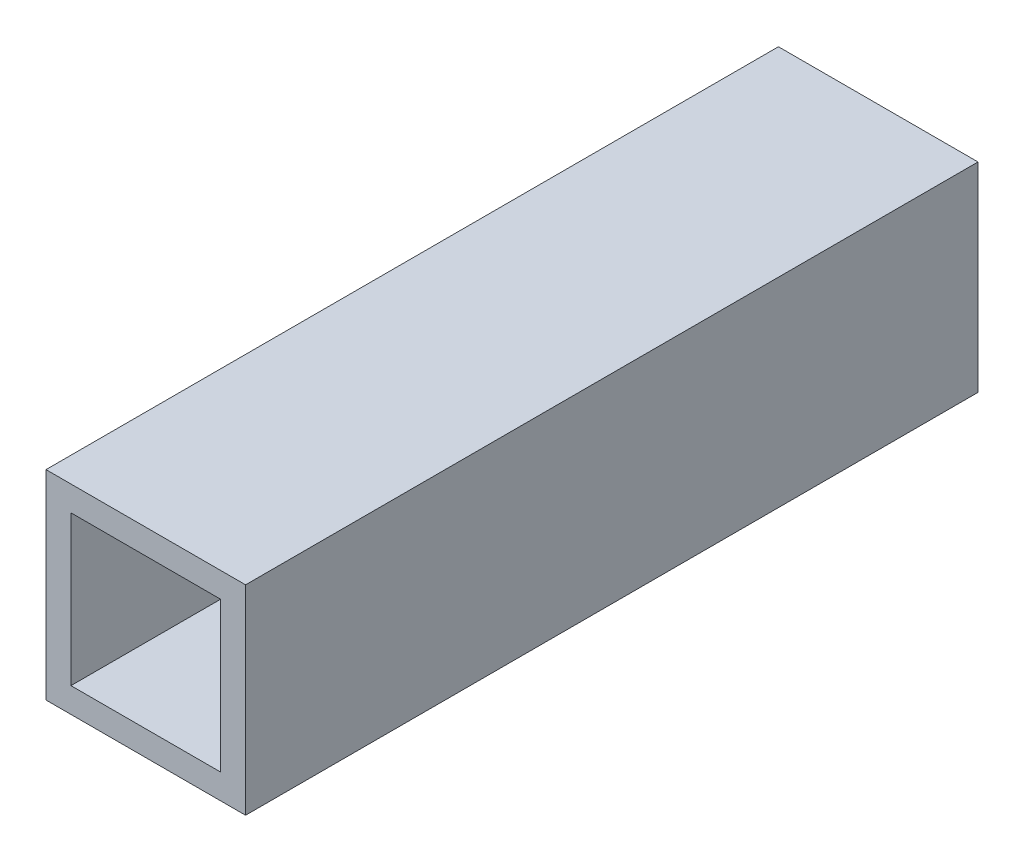
ISO-10303-21;
HEADER;
FILE_DESCRIPTION(('STEP AP214'),'2;1');
FILE_NAME('part.step','',(''),(''),'','','');
FILE_SCHEMA(('AUTOMOTIVE_DESIGN { 1 0 10303 214 1 1 1 1 }'));
ENDSEC;
DATA;
#1=APPLICATION_CONTEXT('core data for automotive mechanical design processes');
#2=APPLICATION_PROTOCOL_DEFINITION('international standard','automotive_design',2000,#1);
#3=PRODUCT_CONTEXT('',#1,'mechanical');
#4=PRODUCT('Part','Part','',(#3));
#5=PRODUCT_RELATED_PRODUCT_CATEGORY('part','',(#4));
#6=PRODUCT_DEFINITION_FORMATION('','',#4);
#7=PRODUCT_DEFINITION_CONTEXT('part definition',#1,'design');
#8=PRODUCT_DEFINITION('design','',#6,#7);
#9=PRODUCT_DEFINITION_SHAPE('','',#8);
#10=(LENGTH_UNIT() NAMED_UNIT(*) SI_UNIT(.MILLI.,.METRE.));
#11=(NAMED_UNIT(*) PLANE_ANGLE_UNIT() SI_UNIT($,.RADIAN.));
#12=(NAMED_UNIT(*) SI_UNIT($,.STERADIAN.) SOLID_ANGLE_UNIT());
#13=UNCERTAINTY_MEASURE_WITH_UNIT(LENGTH_MEASURE(1.E-05),#10,'distance_accuracy_value','');
#14=(GEOMETRIC_REPRESENTATION_CONTEXT(3) GLOBAL_UNCERTAINTY_ASSIGNED_CONTEXT((#13)) GLOBAL_UNIT_ASSIGNED_CONTEXT((#10,
#11,#12)) REPRESENTATION_CONTEXT('',''));
#15=CARTESIAN_POINT('',(0.,0.,0.));
#16=DIRECTION('',(0.,0.,1.));
#17=DIRECTION('',(1.,0.,0.));
#18=AXIS2_PLACEMENT_3D('',#15,#16,#17);
#19=CARTESIAN_POINT('',(0.,0.,93.218));
#20=DIRECTION('',(0.,0.,-1.));
#21=DIRECTION('',(-1.,0.,0.));
#22=AXIS2_PLACEMENT_3D('',#19,#20,#21);
#23=PLANE('',#22);
#24=DIRECTION('',(0.,1.,0.));
#25=VECTOR('',#24,1.);
#26=CARTESIAN_POINT('',(12.7,-12.7,93.218));
#27=LINE('',#26,#25);
#28=CARTESIAN_POINT('',(12.7,-12.7,93.218));
#29=VERTEX_POINT('',#28);
#30=CARTESIAN_POINT('',(12.7,12.7,93.218));
#31=VERTEX_POINT('',#30);
#32=EDGE_CURVE('E139',#29,#31,#27,.T.);
#33=ORIENTED_EDGE('',*,*,#32,.T.);
#34=DIRECTION('',(-1.,0.,0.));
#35=VECTOR('',#34,1.);
#36=CARTESIAN_POINT('',(-12.7,12.7,93.218));
#37=LINE('',#36,#35);
#38=CARTESIAN_POINT('',(-12.7,12.7,93.218));
#39=VERTEX_POINT('',#38);
#40=EDGE_CURVE('E142',#31,#39,#37,.T.);
#41=ORIENTED_EDGE('',*,*,#40,.T.);
#42=DIRECTION('',(0.,-1.,0.));
#43=VECTOR('',#42,1.);
#44=CARTESIAN_POINT('',(-12.7,-12.7,93.218));
#45=LINE('',#44,#43);
#46=CARTESIAN_POINT('',(-12.7,-12.7,93.218));
#47=VERTEX_POINT('',#46);
#48=EDGE_CURVE('E145',#39,#47,#45,.T.);
#49=ORIENTED_EDGE('',*,*,#48,.T.);
#50=DIRECTION('',(1.,0.,0.));
#51=VECTOR('',#50,1.);
#52=CARTESIAN_POINT('',(-12.7,-12.7,93.218));
#53=LINE('',#52,#51);
#54=EDGE_CURVE('E147',#47,#29,#53,.T.);
#55=ORIENTED_EDGE('',*,*,#54,.T.);
#56=EDGE_LOOP('',(#33,#41,#49,#55));
#57=FACE_BOUND('',#56,.T.);
#58=DIRECTION('',(0.,-1.,0.));
#59=VECTOR('',#58,1.);
#60=CARTESIAN_POINT('',(-9.525,-9.525,93.218));
#61=LINE('',#60,#59);
#62=CARTESIAN_POINT('',(-9.525,9.525,93.218));
#63=VERTEX_POINT('',#62);
#64=CARTESIAN_POINT('',(-9.525,-9.525,93.218));
#65=VERTEX_POINT('',#64);
#66=EDGE_CURVE('E101',#63,#65,#61,.T.);
#67=ORIENTED_EDGE('',*,*,#66,.F.);
#68=DIRECTION('',(-1.,0.,0.));
#69=VECTOR('',#68,1.);
#70=CARTESIAN_POINT('',(-9.525,9.525,93.218));
#71=LINE('',#70,#69);
#72=CARTESIAN_POINT('',(9.525,9.525,93.218));
#73=VERTEX_POINT('',#72);
#74=EDGE_CURVE('E124',#73,#63,#71,.T.);
#75=ORIENTED_EDGE('',*,*,#74,.F.);
#76=DIRECTION('',(0.,1.,0.));
#77=VECTOR('',#76,1.);
#78=CARTESIAN_POINT('',(9.525,-9.525,93.218));
#79=LINE('',#78,#77);
#80=CARTESIAN_POINT('',(9.525,-9.525,93.218));
#81=VERTEX_POINT('',#80);
#82=EDGE_CURVE('E122',#81,#73,#79,.T.);
#83=ORIENTED_EDGE('',*,*,#82,.F.);
#84=DIRECTION('',(1.,0.,0.));
#85=VECTOR('',#84,1.);
#86=CARTESIAN_POINT('',(-9.525,-9.525,93.218));
#87=LINE('',#86,#85);
#88=EDGE_CURVE('E109',#65,#81,#87,.T.);
#89=ORIENTED_EDGE('',*,*,#88,.F.);
#90=EDGE_LOOP('',(#67,#75,#83,#89));
#91=FACE_BOUND('',#90,.T.);
#92=ADVANCED_FACE('F36',(#57,#91),#23,.F.);
#93=CARTESIAN_POINT('',(0.,0.,0.));
#94=DIRECTION('',(0.,0.,-1.));
#95=DIRECTION('',(-1.,0.,0.));
#96=AXIS2_PLACEMENT_3D('',#93,#94,#95);
#97=PLANE('',#96);
#98=DIRECTION('',(0.,1.,0.));
#99=VECTOR('',#98,1.);
#100=CARTESIAN_POINT('',(12.7,-12.7,0.));
#101=LINE('',#100,#99);
#102=CARTESIAN_POINT('',(12.7,-12.7,0.));
#103=VERTEX_POINT('',#102);
#104=CARTESIAN_POINT('',(12.7,12.7,0.));
#105=VERTEX_POINT('',#104);
#106=EDGE_CURVE('E118',#103,#105,#101,.T.);
#107=ORIENTED_EDGE('',*,*,#106,.F.);
#108=DIRECTION('',(1.,0.,0.));
#109=VECTOR('',#108,1.);
#110=CARTESIAN_POINT('',(-12.7,-12.7,0.));
#111=LINE('',#110,#109);
#112=CARTESIAN_POINT('',(-12.7,-12.7,0.));
#113=VERTEX_POINT('',#112);
#114=EDGE_CURVE('E143',#113,#103,#111,.T.);
#115=ORIENTED_EDGE('',*,*,#114,.F.);
#116=DIRECTION('',(0.,-1.,0.));
#117=VECTOR('',#116,1.);
#118=CARTESIAN_POINT('',(-12.7,-12.7,0.));
#119=LINE('',#118,#117);
#120=CARTESIAN_POINT('',(-12.7,12.7,0.));
#121=VERTEX_POINT('',#120);
#122=EDGE_CURVE('E154',#121,#113,#119,.T.);
#123=ORIENTED_EDGE('',*,*,#122,.F.);
#124=DIRECTION('',(-1.,0.,0.));
#125=VECTOR('',#124,1.);
#126=CARTESIAN_POINT('',(-12.7,12.7,0.));
#127=LINE('',#126,#125);
#128=EDGE_CURVE('E152',#105,#121,#127,.T.);
#129=ORIENTED_EDGE('',*,*,#128,.F.);
#130=EDGE_LOOP('',(#107,#115,#123,#129));
#131=FACE_BOUND('',#130,.T.);
#132=DIRECTION('',(-1.,0.,0.));
#133=VECTOR('',#132,1.);
#134=CARTESIAN_POINT('',(-9.525,9.525,0.));
#135=LINE('',#134,#133);
#136=CARTESIAN_POINT('',(9.525,9.525,0.));
#137=VERTEX_POINT('',#136);
#138=CARTESIAN_POINT('',(-9.525,9.525,0.));
#139=VERTEX_POINT('',#138);
#140=EDGE_CURVE('E110',#137,#139,#135,.T.);
#141=ORIENTED_EDGE('',*,*,#140,.T.);
#142=DIRECTION('',(0.,-1.,0.));
#143=VECTOR('',#142,1.);
#144=CARTESIAN_POINT('',(-9.525,-9.525,0.));
#145=LINE('',#144,#143);
#146=CARTESIAN_POINT('',(-9.525,-9.525,0.));
#147=VERTEX_POINT('',#146);
#148=EDGE_CURVE('E59',#139,#147,#145,.T.);
#149=ORIENTED_EDGE('',*,*,#148,.T.);
#150=DIRECTION('',(1.,0.,0.));
#151=VECTOR('',#150,1.);
#152=CARTESIAN_POINT('',(-9.525,-9.525,0.));
#153=LINE('',#152,#151);
#154=CARTESIAN_POINT('',(9.525,-9.525,0.));
#155=VERTEX_POINT('',#154);
#156=EDGE_CURVE('E116',#147,#155,#153,.T.);
#157=ORIENTED_EDGE('',*,*,#156,.T.);
#158=DIRECTION('',(0.,1.,0.));
#159=VECTOR('',#158,1.);
#160=CARTESIAN_POINT('',(9.525,-9.525,0.));
#161=LINE('',#160,#159);
#162=EDGE_CURVE('E130',#155,#137,#161,.T.);
#163=ORIENTED_EDGE('',*,*,#162,.T.);
#164=EDGE_LOOP('',(#141,#149,#157,#163));
#165=FACE_BOUND('',#164,.T.);
#166=ADVANCED_FACE('F174',(#131,#165),#97,.T.);
#167=CARTESIAN_POINT('',(12.7,-12.7,93.218));
#168=DIRECTION('',(-1.,0.,0.));
#169=DIRECTION('',(0.,-1.,0.));
#170=AXIS2_PLACEMENT_3D('',#167,#168,#169);
#171=PLANE('',#170);
#172=ORIENTED_EDGE('',*,*,#106,.T.);
#173=DIRECTION('',(0.,0.,-1.));
#174=VECTOR('',#173,1.);
#175=CARTESIAN_POINT('',(12.7,12.7,93.218));
#176=LINE('',#175,#174);
#177=EDGE_CURVE('E11',#31,#105,#176,.T.);
#178=ORIENTED_EDGE('',*,*,#177,.F.);
#179=ORIENTED_EDGE('',*,*,#32,.F.);
#180=DIRECTION('',(0.,0.,-1.));
#181=VECTOR('',#180,1.);
#182=CARTESIAN_POINT('',(12.7,-12.7,93.218));
#183=LINE('',#182,#181);
#184=EDGE_CURVE('E149',#29,#103,#183,.T.);
#185=ORIENTED_EDGE('',*,*,#184,.T.);
#186=EDGE_LOOP('',(#172,#178,#179,#185));
#187=FACE_BOUND('',#186,.T.);
#188=ADVANCED_FACE('F38',(#187),#171,.F.);
#189=CARTESIAN_POINT('',(-12.7,12.7,93.218));
#190=DIRECTION('',(0.,-1.,0.));
#191=DIRECTION('',(0.,0.,-1.));
#192=AXIS2_PLACEMENT_3D('',#189,#190,#191);
#193=PLANE('',#192);
#194=ORIENTED_EDGE('',*,*,#128,.T.);
#195=DIRECTION('',(0.,0.,-1.));
#196=VECTOR('',#195,1.);
#197=CARTESIAN_POINT('',(-12.7,12.7,93.218));
#198=LINE('',#197,#196);
#199=EDGE_CURVE('E44',#39,#121,#198,.T.);
#200=ORIENTED_EDGE('',*,*,#199,.F.);
#201=ORIENTED_EDGE('',*,*,#40,.F.);
#202=ORIENTED_EDGE('',*,*,#177,.T.);
#203=EDGE_LOOP('',(#194,#200,#201,#202));
#204=FACE_BOUND('',#203,.T.);
#205=ADVANCED_FACE('F184',(#204),#193,.F.);
#206=CARTESIAN_POINT('',(-12.7,-12.7,93.218));
#207=DIRECTION('',(1.,0.,0.));
#208=DIRECTION('',(0.,0.,-1.));
#209=AXIS2_PLACEMENT_3D('',#206,#207,#208);
#210=PLANE('',#209);
#211=ORIENTED_EDGE('',*,*,#122,.T.);
#212=DIRECTION('',(0.,0.,-1.));
#213=VECTOR('',#212,1.);
#214=CARTESIAN_POINT('',(-12.7,-12.7,93.218));
#215=LINE('',#214,#213);
#216=EDGE_CURVE('E160',#47,#113,#215,.T.);
#217=ORIENTED_EDGE('',*,*,#216,.F.);
#218=ORIENTED_EDGE('',*,*,#48,.F.);
#219=ORIENTED_EDGE('',*,*,#199,.T.);
#220=EDGE_LOOP('',(#211,#217,#218,#219));
#221=FACE_BOUND('',#220,.T.);
#222=ADVANCED_FACE('F168',(#221),#210,.F.);
#223=CARTESIAN_POINT('',(-12.7,-12.7,93.218));
#224=DIRECTION('',(0.,1.,0.));
#225=DIRECTION('',(0.,0.,1.));
#226=AXIS2_PLACEMENT_3D('',#223,#224,#225);
#227=PLANE('',#226);
#228=ORIENTED_EDGE('',*,*,#114,.T.);
#229=ORIENTED_EDGE('',*,*,#184,.F.);
#230=ORIENTED_EDGE('',*,*,#54,.F.);
#231=ORIENTED_EDGE('',*,*,#216,.T.);
#232=EDGE_LOOP('',(#228,#229,#230,#231));
#233=FACE_BOUND('',#232,.T.);
#234=ADVANCED_FACE('F178',(#233),#227,.F.);
#235=CARTESIAN_POINT('',(-9.525,-9.525,93.218));
#236=DIRECTION('',(1.,0.,0.));
#237=DIRECTION('',(0.,0.,-1.));
#238=AXIS2_PLACEMENT_3D('',#235,#236,#237);
#239=PLANE('',#238);
#240=ORIENTED_EDGE('',*,*,#148,.F.);
#241=DIRECTION('',(0.,0.,-1.));
#242=VECTOR('',#241,1.);
#243=CARTESIAN_POINT('',(-9.525,9.525,93.218));
#244=LINE('',#243,#242);
#245=EDGE_CURVE('E105',#63,#139,#244,.T.);
#246=ORIENTED_EDGE('',*,*,#245,.F.);
#247=ORIENTED_EDGE('',*,*,#66,.T.);
#248=DIRECTION('',(0.,0.,-1.));
#249=VECTOR('',#248,1.);
#250=CARTESIAN_POINT('',(-9.525,-9.525,93.218));
#251=LINE('',#250,#249);
#252=EDGE_CURVE('E104',#65,#147,#251,.T.);
#253=ORIENTED_EDGE('',*,*,#252,.T.);
#254=EDGE_LOOP('',(#240,#246,#247,#253));
#255=FACE_BOUND('',#254,.T.);
#256=ADVANCED_FACE('F103',(#255),#239,.T.);
#257=CARTESIAN_POINT('',(-9.525,-9.525,93.218));
#258=DIRECTION('',(0.,1.,0.));
#259=DIRECTION('',(0.,0.,1.));
#260=AXIS2_PLACEMENT_3D('',#257,#258,#259);
#261=PLANE('',#260);
#262=ORIENTED_EDGE('',*,*,#156,.F.);
#263=ORIENTED_EDGE('',*,*,#252,.F.);
#264=ORIENTED_EDGE('',*,*,#88,.T.);
#265=DIRECTION('',(0.,0.,-1.));
#266=VECTOR('',#265,1.);
#267=CARTESIAN_POINT('',(9.525,-9.525,93.218));
#268=LINE('',#267,#266);
#269=EDGE_CURVE('E119',#81,#155,#268,.T.);
#270=ORIENTED_EDGE('',*,*,#269,.T.);
#271=EDGE_LOOP('',(#262,#263,#264,#270));
#272=FACE_BOUND('',#271,.T.);
#273=ADVANCED_FACE('F113',(#272),#261,.T.);
#274=CARTESIAN_POINT('',(9.525,-9.525,93.218));
#275=DIRECTION('',(-1.,0.,0.));
#276=DIRECTION('',(0.,-1.,0.));
#277=AXIS2_PLACEMENT_3D('',#274,#275,#276);
#278=PLANE('',#277);
#279=ORIENTED_EDGE('',*,*,#162,.F.);
#280=ORIENTED_EDGE('',*,*,#269,.F.);
#281=ORIENTED_EDGE('',*,*,#82,.T.);
#282=DIRECTION('',(0.,0.,-1.));
#283=VECTOR('',#282,1.);
#284=CARTESIAN_POINT('',(9.525,9.525,93.218));
#285=LINE('',#284,#283);
#286=EDGE_CURVE('E51',#73,#137,#285,.T.);
#287=ORIENTED_EDGE('',*,*,#286,.T.);
#288=EDGE_LOOP('',(#279,#280,#281,#287));
#289=FACE_BOUND('',#288,.T.);
#290=ADVANCED_FACE('F207',(#289),#278,.T.);
#291=CARTESIAN_POINT('',(-9.525,9.525,93.218));
#292=DIRECTION('',(0.,-1.,0.));
#293=DIRECTION('',(0.,0.,-1.));
#294=AXIS2_PLACEMENT_3D('',#291,#292,#293);
#295=PLANE('',#294);
#296=ORIENTED_EDGE('',*,*,#140,.F.);
#297=ORIENTED_EDGE('',*,*,#286,.F.);
#298=ORIENTED_EDGE('',*,*,#74,.T.);
#299=ORIENTED_EDGE('',*,*,#245,.T.);
#300=EDGE_LOOP('',(#296,#297,#298,#299));
#301=FACE_BOUND('',#300,.T.);
#302=ADVANCED_FACE('F211',(#301),#295,.T.);
#303=CLOSED_SHELL('',(#92,#166,#188,#205,#222,#234,#256,#273,#290,#302));
#304=MANIFOLD_SOLID_BREP('B2',#303);
#305=ADVANCED_BREP_SHAPE_REPRESENTATION('',(#18,#304),#14);
#306=SHAPE_DEFINITION_REPRESENTATION(#9,#305);
ENDSEC;
END-ISO-10303-21;
